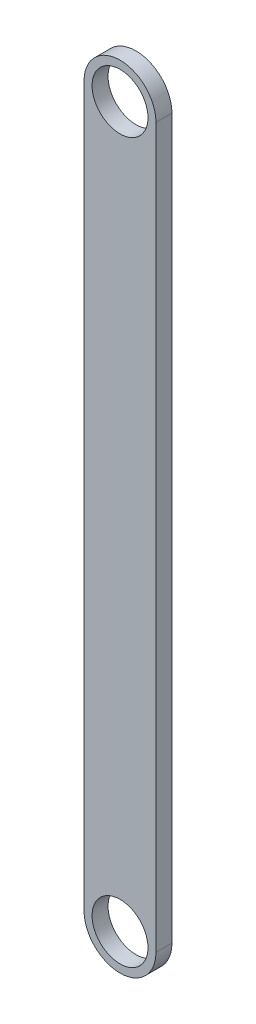
ISO-10303-21;
HEADER;
FILE_DESCRIPTION(('STEP AP214'),'2;1');
FILE_NAME('part.step','',(''),(''),'','','');
FILE_SCHEMA(('AUTOMOTIVE_DESIGN { 1 0 10303 214 1 1 1 1 }'));
ENDSEC;
DATA;
#1=APPLICATION_CONTEXT('core data for automotive mechanical design processes');
#2=APPLICATION_PROTOCOL_DEFINITION('international standard','automotive_design',2000,#1);
#3=PRODUCT_CONTEXT('',#1,'mechanical');
#4=PRODUCT('Part','Part','',(#3));
#5=PRODUCT_RELATED_PRODUCT_CATEGORY('part','',(#4));
#6=PRODUCT_DEFINITION_FORMATION('','',#4);
#7=PRODUCT_DEFINITION_CONTEXT('part definition',#1,'design');
#8=PRODUCT_DEFINITION('design','',#6,#7);
#9=PRODUCT_DEFINITION_SHAPE('','',#8);
#10=(LENGTH_UNIT() NAMED_UNIT(*) SI_UNIT(.MILLI.,.METRE.));
#11=(NAMED_UNIT(*) PLANE_ANGLE_UNIT() SI_UNIT($,.RADIAN.));
#12=(NAMED_UNIT(*) SI_UNIT($,.STERADIAN.) SOLID_ANGLE_UNIT());
#13=UNCERTAINTY_MEASURE_WITH_UNIT(LENGTH_MEASURE(1.E-05),#10,'distance_accuracy_value','');
#14=(GEOMETRIC_REPRESENTATION_CONTEXT(3) GLOBAL_UNCERTAINTY_ASSIGNED_CONTEXT((#13)) GLOBAL_UNIT_ASSIGNED_CONTEXT((#10,
#11,#12)) REPRESENTATION_CONTEXT('',''));
#15=CARTESIAN_POINT('',(0.,0.,0.));
#16=DIRECTION('',(0.,0.,1.));
#17=DIRECTION('',(1.,0.,0.));
#18=AXIS2_PLACEMENT_3D('',#15,#16,#17);
#19=CARTESIAN_POINT('',(0.,-1143.,25.4));
#20=DIRECTION('',(0.,0.,1.));
#21=DIRECTION('',(1.,0.,0.));
#22=AXIS2_PLACEMENT_3D('',#19,#20,#21);
#23=PLANE('',#22);
#24=CARTESIAN_POINT('',(0.,1143.,25.4));
#25=DIRECTION('',(0.,0.,1.));
#26=DIRECTION('',(1.,0.,0.));
#27=AXIS2_PLACEMENT_3D('',#24,#25,#26);
#28=CIRCLE('',#27,88.9);
#29=CARTESIAN_POINT('',(88.9,1143.,25.4));
#30=VERTEX_POINT('',#29);
#31=EDGE_CURVE('E99',#30,#30,#28,.T.);
#32=ORIENTED_EDGE('',*,*,#31,.F.);
#33=EDGE_LOOP('',(#32));
#34=FACE_BOUND('',#33,.T.);
#35=CARTESIAN_POINT('',(0.,-1143.,25.4));
#36=DIRECTION('',(0.,0.,1.));
#37=DIRECTION('',(1.,0.,0.));
#38=AXIS2_PLACEMENT_3D('',#35,#36,#37);
#39=CIRCLE('',#38,114.3);
#40=CARTESIAN_POINT('',(-114.3,-1143.,25.4));
#41=VERTEX_POINT('',#40);
#42=CARTESIAN_POINT('',(114.3,-1143.,25.4));
#43=VERTEX_POINT('',#42);
#44=EDGE_CURVE('E84',#41,#43,#39,.T.);
#45=ORIENTED_EDGE('',*,*,#44,.T.);
#46=DIRECTION('',(0.,1.,0.));
#47=VECTOR('',#46,1.);
#48=CARTESIAN_POINT('',(114.3,-1143.,25.4));
#49=LINE('',#48,#47);
#50=CARTESIAN_POINT('',(114.3,1143.,25.4));
#51=VERTEX_POINT('',#50);
#52=EDGE_CURVE('E79',#43,#51,#49,.T.);
#53=ORIENTED_EDGE('',*,*,#52,.T.);
#54=CARTESIAN_POINT('',(0.,1143.,25.4));
#55=DIRECTION('',(0.,0.,1.));
#56=DIRECTION('',(1.,0.,0.));
#57=AXIS2_PLACEMENT_3D('',#54,#55,#56);
#58=CIRCLE('',#57,114.3);
#59=CARTESIAN_POINT('',(-114.3,1143.,25.4));
#60=VERTEX_POINT('',#59);
#61=EDGE_CURVE('E82',#51,#60,#58,.T.);
#62=ORIENTED_EDGE('',*,*,#61,.T.);
#63=DIRECTION('',(0.,-1.,0.));
#64=VECTOR('',#63,1.);
#65=CARTESIAN_POINT('',(-114.3,-1143.,25.4));
#66=LINE('',#65,#64);
#67=EDGE_CURVE('E49',#60,#41,#66,.T.);
#68=ORIENTED_EDGE('',*,*,#67,.T.);
#69=EDGE_LOOP('',(#45,#53,#62,#68));
#70=FACE_BOUND('',#69,.T.);
#71=CARTESIAN_POINT('',(0.,-1143.,25.4));
#72=DIRECTION('',(0.,0.,1.));
#73=DIRECTION('',(1.,0.,0.));
#74=AXIS2_PLACEMENT_3D('',#71,#72,#73);
#75=CIRCLE('',#74,88.8999999999999);
#76=CARTESIAN_POINT('',(88.8999999999999,-1143.,25.4));
#77=VERTEX_POINT('',#76);
#78=EDGE_CURVE('E114',#77,#77,#75,.T.);
#79=ORIENTED_EDGE('',*,*,#78,.F.);
#80=EDGE_LOOP('',(#79));
#81=FACE_BOUND('',#80,.T.);
#82=ADVANCED_FACE('F32',(#34,#70,#81),#23,.T.);
#83=CARTESIAN_POINT('',(0.,-1143.,-25.4));
#84=DIRECTION('',(0.,0.,1.));
#85=DIRECTION('',(1.,0.,0.));
#86=AXIS2_PLACEMENT_3D('',#83,#84,#85);
#87=PLANE('',#86);
#88=CARTESIAN_POINT('',(0.,-1143.,-25.4));
#89=DIRECTION('',(0.,0.,1.));
#90=DIRECTION('',(1.,0.,0.));
#91=AXIS2_PLACEMENT_3D('',#88,#89,#90);
#92=CIRCLE('',#91,114.3);
#93=CARTESIAN_POINT('',(-114.3,-1143.,-25.4));
#94=VERTEX_POINT('',#93);
#95=CARTESIAN_POINT('',(114.3,-1143.,-25.4));
#96=VERTEX_POINT('',#95);
#97=EDGE_CURVE('E96',#94,#96,#92,.T.);
#98=ORIENTED_EDGE('',*,*,#97,.F.);
#99=DIRECTION('',(0.,-1.,0.));
#100=VECTOR('',#99,1.);
#101=CARTESIAN_POINT('',(-114.3,-1143.,-25.4));
#102=LINE('',#101,#100);
#103=CARTESIAN_POINT('',(-114.3,1143.,-25.4));
#104=VERTEX_POINT('',#103);
#105=EDGE_CURVE('E72',#104,#94,#102,.T.);
#106=ORIENTED_EDGE('',*,*,#105,.F.);
#107=CARTESIAN_POINT('',(0.,1143.,-25.4));
#108=DIRECTION('',(0.,0.,1.));
#109=DIRECTION('',(1.,0.,0.));
#110=AXIS2_PLACEMENT_3D('',#107,#108,#109);
#111=CIRCLE('',#110,114.3);
#112=CARTESIAN_POINT('',(114.3,1143.,-25.4));
#113=VERTEX_POINT('',#112);
#114=EDGE_CURVE('E66',#113,#104,#111,.T.);
#115=ORIENTED_EDGE('',*,*,#114,.F.);
#116=DIRECTION('',(0.,1.,0.));
#117=VECTOR('',#116,1.);
#118=CARTESIAN_POINT('',(114.3,-1143.,-25.4));
#119=LINE('',#118,#117);
#120=EDGE_CURVE('E88',#96,#113,#119,.T.);
#121=ORIENTED_EDGE('',*,*,#120,.F.);
#122=EDGE_LOOP('',(#98,#106,#115,#121));
#123=FACE_BOUND('',#122,.T.);
#124=CARTESIAN_POINT('',(0.,1143.,-25.4));
#125=DIRECTION('',(0.,0.,1.));
#126=DIRECTION('',(1.,0.,0.));
#127=AXIS2_PLACEMENT_3D('',#124,#125,#126);
#128=CIRCLE('',#127,88.9);
#129=CARTESIAN_POINT('',(88.9,1143.,-25.4));
#130=VERTEX_POINT('',#129);
#131=EDGE_CURVE('E111',#130,#130,#128,.T.);
#132=ORIENTED_EDGE('',*,*,#131,.T.);
#133=EDGE_LOOP('',(#132));
#134=FACE_BOUND('',#133,.T.);
#135=CARTESIAN_POINT('',(0.,-1143.,-25.4));
#136=DIRECTION('',(0.,0.,1.));
#137=DIRECTION('',(1.,0.,0.));
#138=AXIS2_PLACEMENT_3D('',#135,#136,#137);
#139=CIRCLE('',#138,88.8999999999999);
#140=CARTESIAN_POINT('',(88.8999999999999,-1143.,-25.4));
#141=VERTEX_POINT('',#140);
#142=EDGE_CURVE('E117',#141,#141,#139,.T.);
#143=ORIENTED_EDGE('',*,*,#142,.T.);
#144=EDGE_LOOP('',(#143));
#145=FACE_BOUND('',#144,.T.);
#146=ADVANCED_FACE('F107',(#123,#134,#145),#87,.F.);
#147=CARTESIAN_POINT('',(0.,-1143.,25.4));
#148=DIRECTION('',(0.,0.,-1.));
#149=DIRECTION('',(-1.,0.,0.));
#150=AXIS2_PLACEMENT_3D('',#147,#148,#149);
#151=CYLINDRICAL_SURFACE('',#150,114.3);
#152=ORIENTED_EDGE('',*,*,#97,.T.);
#153=DIRECTION('',(0.,0.,-1.));
#154=VECTOR('',#153,1.);
#155=CARTESIAN_POINT('',(114.3,-1143.,25.4));
#156=LINE('',#155,#154);
#157=EDGE_CURVE('E11',#43,#96,#156,.T.);
#158=ORIENTED_EDGE('',*,*,#157,.F.);
#159=ORIENTED_EDGE('',*,*,#44,.F.);
#160=DIRECTION('',(0.,0.,-1.));
#161=VECTOR('',#160,1.);
#162=CARTESIAN_POINT('',(-114.3,-1143.,25.4));
#163=LINE('',#162,#161);
#164=EDGE_CURVE('E92',#41,#94,#163,.T.);
#165=ORIENTED_EDGE('',*,*,#164,.T.);
#166=EDGE_LOOP('',(#152,#158,#159,#165));
#167=FACE_BOUND('',#166,.T.);
#168=ADVANCED_FACE('F34',(#167),#151,.T.);
#169=CARTESIAN_POINT('',(114.3,-1143.,25.4));
#170=DIRECTION('',(-1.,0.,0.));
#171=DIRECTION('',(0.,0.,1.));
#172=AXIS2_PLACEMENT_3D('',#169,#170,#171);
#173=PLANE('',#172);
#174=ORIENTED_EDGE('',*,*,#120,.T.);
#175=DIRECTION('',(0.,0.,-1.));
#176=VECTOR('',#175,1.);
#177=CARTESIAN_POINT('',(114.3,1143.,25.4));
#178=LINE('',#177,#176);
#179=EDGE_CURVE('E41',#51,#113,#178,.T.);
#180=ORIENTED_EDGE('',*,*,#179,.F.);
#181=ORIENTED_EDGE('',*,*,#52,.F.);
#182=ORIENTED_EDGE('',*,*,#157,.T.);
#183=EDGE_LOOP('',(#174,#180,#181,#182));
#184=FACE_BOUND('',#183,.T.);
#185=ADVANCED_FACE('F87',(#184),#173,.F.);
#186=CARTESIAN_POINT('',(0.,1143.,25.4));
#187=DIRECTION('',(0.,0.,-1.));
#188=DIRECTION('',(-1.,0.,0.));
#189=AXIS2_PLACEMENT_3D('',#186,#187,#188);
#190=CYLINDRICAL_SURFACE('',#189,114.3);
#191=ORIENTED_EDGE('',*,*,#114,.T.);
#192=DIRECTION('',(0.,0.,-1.));
#193=VECTOR('',#192,1.);
#194=CARTESIAN_POINT('',(-114.3,1143.,25.4));
#195=LINE('',#194,#193);
#196=EDGE_CURVE('E89',#60,#104,#195,.T.);
#197=ORIENTED_EDGE('',*,*,#196,.F.);
#198=ORIENTED_EDGE('',*,*,#61,.F.);
#199=ORIENTED_EDGE('',*,*,#179,.T.);
#200=EDGE_LOOP('',(#191,#197,#198,#199));
#201=FACE_BOUND('',#200,.T.);
#202=ADVANCED_FACE('F90',(#201),#190,.T.);
#203=CARTESIAN_POINT('',(-114.3,-1143.,25.4));
#204=DIRECTION('',(1.,0.,0.));
#205=DIRECTION('',(0.,0.,-1.));
#206=AXIS2_PLACEMENT_3D('',#203,#204,#205);
#207=PLANE('',#206);
#208=ORIENTED_EDGE('',*,*,#105,.T.);
#209=ORIENTED_EDGE('',*,*,#164,.F.);
#210=ORIENTED_EDGE('',*,*,#67,.F.);
#211=ORIENTED_EDGE('',*,*,#196,.T.);
#212=EDGE_LOOP('',(#208,#209,#210,#211));
#213=FACE_BOUND('',#212,.T.);
#214=ADVANCED_FACE('F104',(#213),#207,.F.);
#215=CARTESIAN_POINT('',(0.,1143.,25.4));
#216=DIRECTION('',(0.,0.,-1.));
#217=DIRECTION('',(-1.,0.,0.));
#218=AXIS2_PLACEMENT_3D('',#215,#216,#217);
#219=CYLINDRICAL_SURFACE('',#218,88.9);
#220=ORIENTED_EDGE('',*,*,#31,.T.);
#221=EDGE_LOOP('',(#220));
#222=FACE_BOUND('',#221,.T.);
#223=ORIENTED_EDGE('',*,*,#131,.F.);
#224=EDGE_LOOP('',(#223));
#225=FACE_BOUND('',#224,.T.);
#226=ADVANCED_FACE('F134',(#222,#225),#219,.F.);
#227=CARTESIAN_POINT('',(0.,-1143.,25.4));
#228=DIRECTION('',(0.,0.,-1.));
#229=DIRECTION('',(-1.,0.,0.));
#230=AXIS2_PLACEMENT_3D('',#227,#228,#229);
#231=CYLINDRICAL_SURFACE('',#230,88.8999999999999);
#232=ORIENTED_EDGE('',*,*,#78,.T.);
#233=EDGE_LOOP('',(#232));
#234=FACE_BOUND('',#233,.T.);
#235=ORIENTED_EDGE('',*,*,#142,.F.);
#236=EDGE_LOOP('',(#235));
#237=FACE_BOUND('',#236,.T.);
#238=ADVANCED_FACE('F123',(#234,#237),#231,.F.);
#239=CLOSED_SHELL('',(#82,#146,#168,#185,#202,#214,#226,#238));
#240=MANIFOLD_SOLID_BREP('B2',#239);
#241=ADVANCED_BREP_SHAPE_REPRESENTATION('',(#18,#240),#14);
#242=SHAPE_DEFINITION_REPRESENTATION(#9,#241);
ENDSEC;
END-ISO-10303-21;
